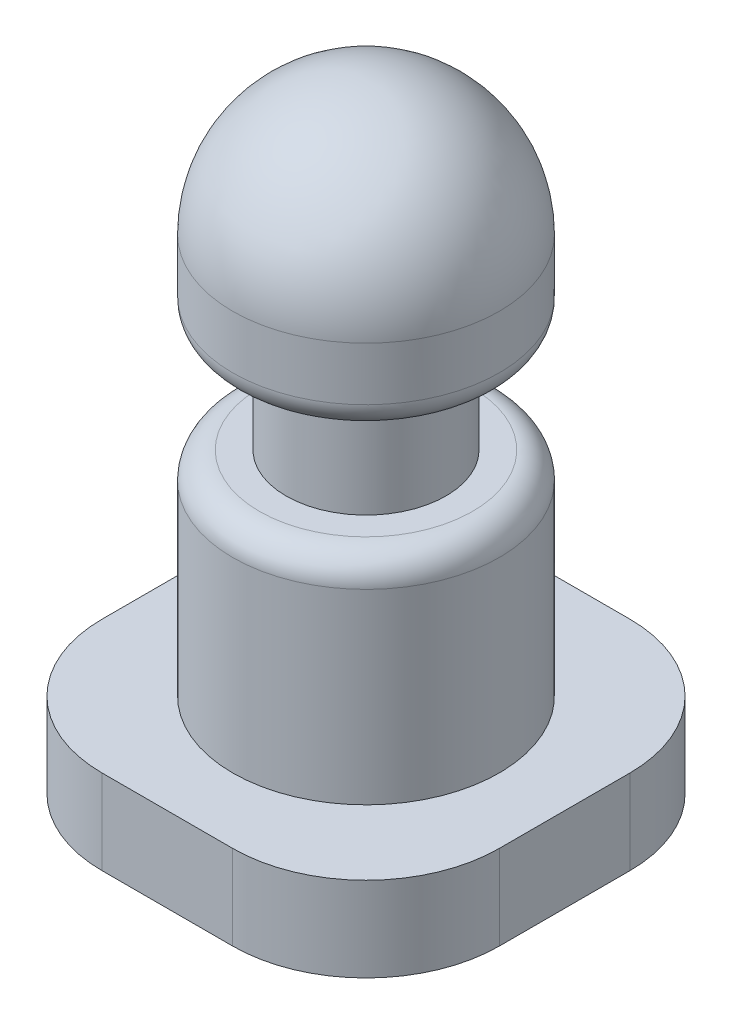
ISO-10303-21;
HEADER;
FILE_DESCRIPTION(('STEP AP214'),'2;1');
FILE_NAME('part.step','',(''),(''),'','','');
FILE_SCHEMA(('AUTOMOTIVE_DESIGN { 1 0 10303 214 1 1 1 1 }'));
ENDSEC;
DATA;
#1=APPLICATION_CONTEXT('core data for automotive mechanical design processes');
#2=APPLICATION_PROTOCOL_DEFINITION('international standard','automotive_design',2000,#1);
#3=PRODUCT_CONTEXT('',#1,'mechanical');
#4=PRODUCT('Part','Part','',(#3));
#5=PRODUCT_RELATED_PRODUCT_CATEGORY('part','',(#4));
#6=PRODUCT_DEFINITION_FORMATION('','',#4);
#7=PRODUCT_DEFINITION_CONTEXT('part definition',#1,'design');
#8=PRODUCT_DEFINITION('design','',#6,#7);
#9=PRODUCT_DEFINITION_SHAPE('','',#8);
#10=(LENGTH_UNIT() NAMED_UNIT(*) SI_UNIT(.MILLI.,.METRE.));
#11=(NAMED_UNIT(*) PLANE_ANGLE_UNIT() SI_UNIT($,.RADIAN.));
#12=(NAMED_UNIT(*) SI_UNIT($,.STERADIAN.) SOLID_ANGLE_UNIT());
#13=UNCERTAINTY_MEASURE_WITH_UNIT(LENGTH_MEASURE(1.E-05),#10,'distance_accuracy_value','');
#14=(GEOMETRIC_REPRESENTATION_CONTEXT(3) GLOBAL_UNCERTAINTY_ASSIGNED_CONTEXT((#13)) GLOBAL_UNIT_ASSIGNED_CONTEXT((#10,
#11,#12)) REPRESENTATION_CONTEXT('',''));
#15=CARTESIAN_POINT('',(0.,0.,0.));
#16=DIRECTION('',(0.,0.,1.));
#17=DIRECTION('',(1.,0.,0.));
#18=AXIS2_PLACEMENT_3D('',#15,#16,#17);
#19=CARTESIAN_POINT('',(0.,46.35,0.));
#20=DIRECTION('',(0.,-1.,0.));
#21=DIRECTION('',(0.,0.,-1.));
#22=AXIS2_PLACEMENT_3D('',#19,#20,#21);
#23=CYLINDRICAL_SURFACE('',#22,10.);
#24=CARTESIAN_POINT('',(0.,20.35,0.));
#25=DIRECTION('',(0.,1.,0.));
#26=DIRECTION('',(0.,0.,1.));
#27=AXIS2_PLACEMENT_3D('',#24,#25,#26);
#28=CIRCLE('',#27,10.);
#29=CARTESIAN_POINT('',(0.,20.35,10.));
#30=VERTEX_POINT('',#29);
#31=EDGE_CURVE('E11',#30,#30,#28,.F.);
#32=ORIENTED_EDGE('',*,*,#31,.T.);
#33=EDGE_LOOP('',(#32));
#34=FACE_BOUND('',#33,.T.);
#35=CARTESIAN_POINT('',(0.,6.35,0.));
#36=DIRECTION('',(0.,1.,0.));
#37=DIRECTION('',(0.,0.,1.));
#38=AXIS2_PLACEMENT_3D('',#35,#36,#37);
#39=CIRCLE('',#38,10.);
#40=CARTESIAN_POINT('',(0.,6.35,10.));
#41=VERTEX_POINT('',#40);
#42=EDGE_CURVE('E169',#41,#41,#39,.T.);
#43=ORIENTED_EDGE('',*,*,#42,.T.);
#44=EDGE_LOOP('',(#43));
#45=FACE_BOUND('',#44,.T.);
#46=ADVANCED_FACE('F43',(#34,#45),#23,.T.);
#47=CARTESIAN_POINT('',(-14.9,6.35,0.));
#48=DIRECTION('',(-1.,0.,0.));
#49=DIRECTION('',(0.,0.,1.));
#50=AXIS2_PLACEMENT_3D('',#47,#48,#49);
#51=PLANE('',#50);
#52=DIRECTION('',(0.,0.,-1.));
#53=VECTOR('',#52,1.);
#54=CARTESIAN_POINT('',(-14.9,0.,0.));
#55=LINE('',#54,#53);
#56=CARTESIAN_POINT('',(-14.9,0.,4.9));
#57=VERTEX_POINT('',#56);
#58=CARTESIAN_POINT('',(-14.9,0.,-4.9));
#59=VERTEX_POINT('',#58);
#60=EDGE_CURVE('E140',#57,#59,#55,.T.);
#61=ORIENTED_EDGE('',*,*,#60,.F.);
#62=DIRECTION('',(0.,-1.,0.));
#63=VECTOR('',#62,1.);
#64=CARTESIAN_POINT('',(-14.9,6.35,4.9));
#65=LINE('',#64,#63);
#66=CARTESIAN_POINT('',(-14.9,6.35,4.9));
#67=VERTEX_POINT('',#66);
#68=EDGE_CURVE('E163',#57,#67,#65,.F.);
#69=ORIENTED_EDGE('',*,*,#68,.T.);
#70=DIRECTION('',(0.,0.,-1.));
#71=VECTOR('',#70,1.);
#72=CARTESIAN_POINT('',(-14.9,6.35,0.));
#73=LINE('',#72,#71);
#74=CARTESIAN_POINT('',(-14.9,6.35,-4.9));
#75=VERTEX_POINT('',#74);
#76=EDGE_CURVE('E138',#67,#75,#73,.T.);
#77=ORIENTED_EDGE('',*,*,#76,.T.);
#78=DIRECTION('',(0.,-1.,0.));
#79=VECTOR('',#78,1.);
#80=CARTESIAN_POINT('',(-14.9,6.35,-4.9));
#81=LINE('',#80,#79);
#82=EDGE_CURVE('E160',#75,#59,#81,.T.);
#83=ORIENTED_EDGE('',*,*,#82,.T.);
#84=EDGE_LOOP('',(#61,#69,#77,#83));
#85=FACE_BOUND('',#84,.T.);
#86=ADVANCED_FACE('F200',(#85),#51,.T.);
#87=CARTESIAN_POINT('',(0.,6.35,14.9));
#88=DIRECTION('',(0.,0.,-1.));
#89=DIRECTION('',(-1.,0.,0.));
#90=AXIS2_PLACEMENT_3D('',#87,#88,#89);
#91=PLANE('',#90);
#92=DIRECTION('',(1.,0.,0.));
#93=VECTOR('',#92,1.);
#94=CARTESIAN_POINT('',(0.,0.,14.9));
#95=LINE('',#94,#93);
#96=CARTESIAN_POINT('',(-4.9,0.,14.9));
#97=VERTEX_POINT('',#96);
#98=CARTESIAN_POINT('',(4.9,0.,14.9));
#99=VERTEX_POINT('',#98);
#100=EDGE_CURVE('E136',#97,#99,#95,.T.);
#101=ORIENTED_EDGE('',*,*,#100,.T.);
#102=DIRECTION('',(0.,-1.,0.));
#103=VECTOR('',#102,1.);
#104=CARTESIAN_POINT('',(4.9,6.35,14.9));
#105=LINE('',#104,#103);
#106=CARTESIAN_POINT('',(4.9,6.35,14.9));
#107=VERTEX_POINT('',#106);
#108=EDGE_CURVE('E115',#99,#107,#105,.F.);
#109=ORIENTED_EDGE('',*,*,#108,.T.);
#110=DIRECTION('',(1.,0.,0.));
#111=VECTOR('',#110,1.);
#112=CARTESIAN_POINT('',(0.,6.35,14.9));
#113=LINE('',#112,#111);
#114=CARTESIAN_POINT('',(-4.9,6.35,14.9));
#115=VERTEX_POINT('',#114);
#116=EDGE_CURVE('E265',#115,#107,#113,.T.);
#117=ORIENTED_EDGE('',*,*,#116,.F.);
#118=DIRECTION('',(0.,-1.,0.));
#119=VECTOR('',#118,1.);
#120=CARTESIAN_POINT('',(-4.9,0.,14.9));
#121=LINE('',#120,#119);
#122=EDGE_CURVE('E120',#115,#97,#121,.T.);
#123=ORIENTED_EDGE('',*,*,#122,.T.);
#124=EDGE_LOOP('',(#101,#109,#117,#123));
#125=FACE_BOUND('',#124,.T.);
#126=ADVANCED_FACE('F208',(#125),#91,.F.);
#127=CARTESIAN_POINT('',(14.9,6.35,0.));
#128=DIRECTION('',(-1.,0.,0.));
#129=DIRECTION('',(0.,0.,1.));
#130=AXIS2_PLACEMENT_3D('',#127,#128,#129);
#131=PLANE('',#130);
#132=DIRECTION('',(0.,0.,-1.));
#133=VECTOR('',#132,1.);
#134=CARTESIAN_POINT('',(14.9,6.35,0.));
#135=LINE('',#134,#133);
#136=CARTESIAN_POINT('',(14.9,6.35,4.9));
#137=VERTEX_POINT('',#136);
#138=CARTESIAN_POINT('',(14.9,6.35,-4.9));
#139=VERTEX_POINT('',#138);
#140=EDGE_CURVE('E129',#137,#139,#135,.T.);
#141=ORIENTED_EDGE('',*,*,#140,.F.);
#142=DIRECTION('',(0.,-1.,0.));
#143=VECTOR('',#142,1.);
#144=CARTESIAN_POINT('',(14.9,6.35,4.9));
#145=LINE('',#144,#143);
#146=CARTESIAN_POINT('',(14.9,0.,4.9));
#147=VERTEX_POINT('',#146);
#148=EDGE_CURVE('E114',#137,#147,#145,.T.);
#149=ORIENTED_EDGE('',*,*,#148,.T.);
#150=DIRECTION('',(0.,0.,-1.));
#151=VECTOR('',#150,1.);
#152=CARTESIAN_POINT('',(14.9,0.,0.));
#153=LINE('',#152,#151);
#154=CARTESIAN_POINT('',(14.9,0.,-4.9));
#155=VERTEX_POINT('',#154);
#156=EDGE_CURVE('E127',#147,#155,#153,.T.);
#157=ORIENTED_EDGE('',*,*,#156,.T.);
#158=DIRECTION('',(0.,-1.,0.));
#159=VECTOR('',#158,1.);
#160=CARTESIAN_POINT('',(14.9,6.35,-4.9));
#161=LINE('',#160,#159);
#162=EDGE_CURVE('E131',#155,#139,#161,.F.);
#163=ORIENTED_EDGE('',*,*,#162,.T.);
#164=EDGE_LOOP('',(#141,#149,#157,#163));
#165=FACE_BOUND('',#164,.T.);
#166=ADVANCED_FACE('F126',(#165),#131,.F.);
#167=CARTESIAN_POINT('',(0.,6.35,-14.9));
#168=DIRECTION('',(0.,0.,-1.));
#169=DIRECTION('',(-1.,0.,0.));
#170=AXIS2_PLACEMENT_3D('',#167,#168,#169);
#171=PLANE('',#170);
#172=DIRECTION('',(1.,0.,0.));
#173=VECTOR('',#172,1.);
#174=CARTESIAN_POINT('',(0.,0.,-14.9));
#175=LINE('',#174,#173);
#176=CARTESIAN_POINT('',(-4.9,0.,-14.9));
#177=VERTEX_POINT('',#176);
#178=CARTESIAN_POINT('',(4.9,0.,-14.9));
#179=VERTEX_POINT('',#178);
#180=EDGE_CURVE('E135',#177,#179,#175,.T.);
#181=ORIENTED_EDGE('',*,*,#180,.F.);
#182=DIRECTION('',(0.,-1.,0.));
#183=VECTOR('',#182,1.);
#184=CARTESIAN_POINT('',(-4.9,6.35,-14.9));
#185=LINE('',#184,#183);
#186=CARTESIAN_POINT('',(-4.9,6.35,-14.9));
#187=VERTEX_POINT('',#186);
#188=EDGE_CURVE('E65',#177,#187,#185,.F.);
#189=ORIENTED_EDGE('',*,*,#188,.T.);
#190=DIRECTION('',(1.,0.,0.));
#191=VECTOR('',#190,1.);
#192=CARTESIAN_POINT('',(0.,6.35,-14.9));
#193=LINE('',#192,#191);
#194=CARTESIAN_POINT('',(4.9,6.35,-14.9));
#195=VERTEX_POINT('',#194);
#196=EDGE_CURVE('E144',#187,#195,#193,.T.);
#197=ORIENTED_EDGE('',*,*,#196,.T.);
#198=DIRECTION('',(0.,-1.,0.));
#199=VECTOR('',#198,1.);
#200=CARTESIAN_POINT('',(4.9,0.,-14.9));
#201=LINE('',#200,#199);
#202=EDGE_CURVE('E165',#195,#179,#201,.T.);
#203=ORIENTED_EDGE('',*,*,#202,.T.);
#204=EDGE_LOOP('',(#181,#189,#197,#203));
#205=FACE_BOUND('',#204,.T.);
#206=ADVANCED_FACE('F253',(#205),#171,.T.);
#207=CARTESIAN_POINT('',(0.,6.35,0.));
#208=DIRECTION('',(0.,1.,0.));
#209=DIRECTION('',(0.,0.,1.));
#210=AXIS2_PLACEMENT_3D('',#207,#208,#209);
#211=PLANE('',#210);
#212=ORIENTED_EDGE('',*,*,#42,.F.);
#213=EDGE_LOOP('',(#212));
#214=FACE_BOUND('',#213,.T.);
#215=ORIENTED_EDGE('',*,*,#116,.T.);
#216=CARTESIAN_POINT('',(4.9,6.35,4.9));
#217=DIRECTION('',(0.,1.,0.));
#218=DIRECTION('',(0.,0.,1.));
#219=AXIS2_PLACEMENT_3D('',#216,#217,#218);
#220=CIRCLE('',#219,10.);
#221=EDGE_CURVE('E158',#107,#137,#220,.T.);
#222=ORIENTED_EDGE('',*,*,#221,.T.);
#223=ORIENTED_EDGE('',*,*,#140,.T.);
#224=CARTESIAN_POINT('',(4.9,6.35,-4.9));
#225=DIRECTION('',(0.,1.,0.));
#226=DIRECTION('',(0.,0.,1.));
#227=AXIS2_PLACEMENT_3D('',#224,#225,#226);
#228=CIRCLE('',#227,10.);
#229=EDGE_CURVE('E58',#139,#195,#228,.T.);
#230=ORIENTED_EDGE('',*,*,#229,.T.);
#231=ORIENTED_EDGE('',*,*,#196,.F.);
#232=CARTESIAN_POINT('',(-4.9,6.35,-4.9));
#233=DIRECTION('',(0.,1.,0.));
#234=DIRECTION('',(0.,0.,1.));
#235=AXIS2_PLACEMENT_3D('',#232,#233,#234);
#236=CIRCLE('',#235,10.);
#237=EDGE_CURVE('E154',#187,#75,#236,.T.);
#238=ORIENTED_EDGE('',*,*,#237,.T.);
#239=ORIENTED_EDGE('',*,*,#76,.F.);
#240=CARTESIAN_POINT('',(-4.9,6.35,4.9));
#241=DIRECTION('',(0.,1.,0.));
#242=DIRECTION('',(0.,0.,1.));
#243=AXIS2_PLACEMENT_3D('',#240,#241,#242);
#244=CIRCLE('',#243,10.);
#245=EDGE_CURVE('E156',#67,#115,#244,.T.);
#246=ORIENTED_EDGE('',*,*,#245,.T.);
#247=EDGE_LOOP('',(#215,#222,#223,#230,#231,#238,#239,#246));
#248=FACE_BOUND('',#247,.T.);
#249=ADVANCED_FACE('F256',(#214,#248),#211,.T.);
#250=CARTESIAN_POINT('',(0.,0.,0.));
#251=DIRECTION('',(0.,1.,0.));
#252=DIRECTION('',(0.,0.,1.));
#253=AXIS2_PLACEMENT_3D('',#250,#251,#252);
#254=PLANE('',#253);
#255=CARTESIAN_POINT('',(0.,0.,0.));
#256=DIRECTION('',(0.,-1.,0.));
#257=DIRECTION('',(0.,0.,-1.));
#258=AXIS2_PLACEMENT_3D('',#255,#256,#257);
#259=CIRCLE('',#258,2.1225);
#260=CARTESIAN_POINT('',(0.,0.,-2.1225));
#261=VERTEX_POINT('',#260);
#262=EDGE_CURVE('E287',#261,#261,#259,.T.);
#263=ORIENTED_EDGE('',*,*,#262,.F.);
#264=EDGE_LOOP('',(#263));
#265=FACE_BOUND('',#264,.T.);
#266=ORIENTED_EDGE('',*,*,#156,.F.);
#267=CARTESIAN_POINT('',(4.9,0.,4.9));
#268=DIRECTION('',(0.,1.,0.));
#269=DIRECTION('',(0.,0.,1.));
#270=AXIS2_PLACEMENT_3D('',#267,#268,#269);
#271=CIRCLE('',#270,10.);
#272=EDGE_CURVE('E110',#147,#99,#271,.F.);
#273=ORIENTED_EDGE('',*,*,#272,.T.);
#274=ORIENTED_EDGE('',*,*,#100,.F.);
#275=CARTESIAN_POINT('',(-4.9,0.,4.9));
#276=DIRECTION('',(0.,1.,0.));
#277=DIRECTION('',(0.,0.,1.));
#278=AXIS2_PLACEMENT_3D('',#275,#276,#277);
#279=CIRCLE('',#278,10.);
#280=EDGE_CURVE('E121',#97,#57,#279,.F.);
#281=ORIENTED_EDGE('',*,*,#280,.T.);
#282=ORIENTED_EDGE('',*,*,#60,.T.);
#283=CARTESIAN_POINT('',(-4.9,0.,-4.9));
#284=DIRECTION('',(0.,1.,0.));
#285=DIRECTION('',(0.,0.,1.));
#286=AXIS2_PLACEMENT_3D('',#283,#284,#285);
#287=CIRCLE('',#286,10.);
#288=EDGE_CURVE('E147',#59,#177,#287,.F.);
#289=ORIENTED_EDGE('',*,*,#288,.T.);
#290=ORIENTED_EDGE('',*,*,#180,.T.);
#291=CARTESIAN_POINT('',(4.9,0.,-4.9));
#292=DIRECTION('',(0.,1.,0.));
#293=DIRECTION('',(0.,0.,1.));
#294=AXIS2_PLACEMENT_3D('',#291,#292,#293);
#295=CIRCLE('',#294,10.);
#296=EDGE_CURVE('E130',#179,#155,#295,.F.);
#297=ORIENTED_EDGE('',*,*,#296,.T.);
#298=EDGE_LOOP('',(#266,#273,#274,#281,#282,#289,#290,#297));
#299=FACE_BOUND('',#298,.T.);
#300=ADVANCED_FACE('F133',(#265,#299),#254,.F.);
#301=CARTESIAN_POINT('',(4.9,6.35,4.9));
#302=DIRECTION('',(0.,-1.,0.));
#303=DIRECTION('',(0.,0.,-1.));
#304=AXIS2_PLACEMENT_3D('',#301,#302,#303);
#305=CYLINDRICAL_SURFACE('',#304,10.);
#306=ORIENTED_EDGE('',*,*,#221,.F.);
#307=ORIENTED_EDGE('',*,*,#108,.F.);
#308=ORIENTED_EDGE('',*,*,#272,.F.);
#309=ORIENTED_EDGE('',*,*,#148,.F.);
#310=EDGE_LOOP('',(#306,#307,#308,#309));
#311=FACE_BOUND('',#310,.T.);
#312=ADVANCED_FACE('F113',(#311),#305,.T.);
#313=CARTESIAN_POINT('',(-4.9,6.35,4.9));
#314=DIRECTION('',(0.,1.,0.));
#315=DIRECTION('',(0.,0.,1.));
#316=AXIS2_PLACEMENT_3D('',#313,#314,#315);
#317=CYLINDRICAL_SURFACE('',#316,10.);
#318=ORIENTED_EDGE('',*,*,#245,.F.);
#319=ORIENTED_EDGE('',*,*,#68,.F.);
#320=ORIENTED_EDGE('',*,*,#280,.F.);
#321=ORIENTED_EDGE('',*,*,#122,.F.);
#322=EDGE_LOOP('',(#318,#319,#320,#321));
#323=FACE_BOUND('',#322,.T.);
#324=ADVANCED_FACE('F241',(#323),#317,.T.);
#325=CARTESIAN_POINT('',(-4.9,6.35,-4.9));
#326=DIRECTION('',(0.,-1.,0.));
#327=DIRECTION('',(0.,0.,-1.));
#328=AXIS2_PLACEMENT_3D('',#325,#326,#327);
#329=CYLINDRICAL_SURFACE('',#328,10.);
#330=ORIENTED_EDGE('',*,*,#237,.F.);
#331=ORIENTED_EDGE('',*,*,#188,.F.);
#332=ORIENTED_EDGE('',*,*,#288,.F.);
#333=ORIENTED_EDGE('',*,*,#82,.F.);
#334=EDGE_LOOP('',(#330,#331,#332,#333));
#335=FACE_BOUND('',#334,.T.);
#336=ADVANCED_FACE('F237',(#335),#329,.T.);
#337=CARTESIAN_POINT('',(4.9,6.35,-4.9));
#338=DIRECTION('',(0.,1.,0.));
#339=DIRECTION('',(0.,0.,1.));
#340=AXIS2_PLACEMENT_3D('',#337,#338,#339);
#341=CYLINDRICAL_SURFACE('',#340,10.);
#342=ORIENTED_EDGE('',*,*,#229,.F.);
#343=ORIENTED_EDGE('',*,*,#162,.F.);
#344=ORIENTED_EDGE('',*,*,#296,.F.);
#345=ORIENTED_EDGE('',*,*,#202,.F.);
#346=EDGE_LOOP('',(#342,#343,#344,#345));
#347=FACE_BOUND('',#346,.T.);
#348=ADVANCED_FACE('F233',(#347),#341,.T.);
#349=CARTESIAN_POINT('',(0.,30.35,0.));
#350=DIRECTION('',(0.,1.,0.));
#351=DIRECTION('',(0.,0.,1.));
#352=AXIS2_PLACEMENT_3D('',#349,#350,#351);
#353=PLANE('',#352);
#354=CARTESIAN_POINT('',(0.,30.35,0.));
#355=DIRECTION('',(0.,1.,0.));
#356=DIRECTION('',(0.,0.,1.));
#357=AXIS2_PLACEMENT_3D('',#354,#355,#356);
#358=CIRCLE('',#357,8.);
#359=CARTESIAN_POINT('',(0.,30.35,8.));
#360=VERTEX_POINT('',#359);
#361=EDGE_CURVE('E176',#360,#360,#358,.F.);
#362=ORIENTED_EDGE('',*,*,#361,.T.);
#363=EDGE_LOOP('',(#362));
#364=FACE_BOUND('',#363,.T.);
#365=CARTESIAN_POINT('',(0.,30.35,0.));
#366=DIRECTION('',(0.,1.,0.));
#367=DIRECTION('',(0.,0.,1.));
#368=AXIS2_PLACEMENT_3D('',#365,#366,#367);
#369=CIRCLE('',#368,6.);
#370=CARTESIAN_POINT('',(0.,30.35,6.));
#371=VERTEX_POINT('',#370);
#372=EDGE_CURVE('E276',#371,#371,#369,.T.);
#373=ORIENTED_EDGE('',*,*,#372,.T.);
#374=EDGE_LOOP('',(#373));
#375=FACE_BOUND('',#374,.T.);
#376=ADVANCED_FACE('F236',(#364,#375),#353,.F.);
#377=CARTESIAN_POINT('',(0.,30.35,0.));
#378=DIRECTION('',(0.,-1.,0.));
#379=DIRECTION('',(0.,0.,-1.));
#380=AXIS2_PLACEMENT_3D('',#377,#378,#379);
#381=CYLINDRICAL_SURFACE('',#380,6.);
#382=ORIENTED_EDGE('',*,*,#372,.F.);
#383=EDGE_LOOP('',(#382));
#384=FACE_BOUND('',#383,.T.);
#385=CARTESIAN_POINT('',(0.,22.35,0.));
#386=DIRECTION('',(0.,1.,0.));
#387=DIRECTION('',(0.,0.,1.));
#388=AXIS2_PLACEMENT_3D('',#385,#386,#387);
#389=CIRCLE('',#388,6.);
#390=CARTESIAN_POINT('',(0.,22.35,6.));
#391=VERTEX_POINT('',#390);
#392=EDGE_CURVE('E279',#391,#391,#389,.T.);
#393=ORIENTED_EDGE('',*,*,#392,.T.);
#394=EDGE_LOOP('',(#393));
#395=FACE_BOUND('',#394,.T.);
#396=ADVANCED_FACE('F230',(#384,#395),#381,.T.);
#397=CARTESIAN_POINT('',(0.,22.35,0.));
#398=DIRECTION('',(0.,1.,0.));
#399=DIRECTION('',(0.,0.,1.));
#400=AXIS2_PLACEMENT_3D('',#397,#398,#399);
#401=PLANE('',#400);
#402=CARTESIAN_POINT('',(0.,22.35,0.));
#403=DIRECTION('',(0.,1.,0.));
#404=DIRECTION('',(0.,0.,1.));
#405=AXIS2_PLACEMENT_3D('',#402,#403,#404);
#406=CIRCLE('',#405,8.);
#407=CARTESIAN_POINT('',(0.,22.35,8.));
#408=VERTEX_POINT('',#407);
#409=EDGE_CURVE('E51',#408,#408,#406,.T.);
#410=ORIENTED_EDGE('',*,*,#409,.T.);
#411=EDGE_LOOP('',(#410));
#412=FACE_BOUND('',#411,.T.);
#413=ORIENTED_EDGE('',*,*,#392,.F.);
#414=EDGE_LOOP('',(#413));
#415=FACE_BOUND('',#414,.T.);
#416=ADVANCED_FACE('F181',(#412,#415),#401,.T.);
#417=CARTESIAN_POINT('',(0.,36.35,0.));
#418=DIRECTION('',(0.,1.,0.));
#419=DIRECTION('',(0.,0.,1.));
#420=AXIS2_PLACEMENT_3D('',#417,#418,#419);
#421=SPHERICAL_SURFACE('',#420,10.);
#422=CARTESIAN_POINT('',(0.,36.35,0.));
#423=DIRECTION('',(0.,-1.,0.));
#424=DIRECTION('',(0.,0.,-1.));
#425=AXIS2_PLACEMENT_3D('',#422,#423,#424);
#426=CIRCLE('',#425,10.);
#427=CARTESIAN_POINT('',(0.,36.35,-10.));
#428=VERTEX_POINT('',#427);
#429=EDGE_CURVE('E170',#428,#428,#426,.T.);
#430=ORIENTED_EDGE('',*,*,#429,.F.);
#431=EDGE_LOOP('',(#430));
#432=FACE_BOUND('',#431,.T.);
#433=ADVANCED_FACE('F215',(#432),#421,.T.);
#434=CARTESIAN_POINT('',(0.,32.35,0.));
#435=DIRECTION('',(0.,1.,0.));
#436=DIRECTION('',(0.,0.,1.));
#437=AXIS2_PLACEMENT_3D('',#434,#435,#436);
#438=CIRCLE('',#437,10.);
#439=CARTESIAN_POINT('',(0.,32.35,10.));
#440=VERTEX_POINT('',#439);
#441=EDGE_CURVE('E173',#440,#440,#438,.T.);
#442=ORIENTED_EDGE('',*,*,#441,.T.);
#443=EDGE_LOOP('',(#442));
#444=FACE_BOUND('',#443,.T.);
#445=ORIENTED_EDGE('',*,*,#429,.T.);
#446=EDGE_LOOP('',(#445));
#447=FACE_BOUND('',#446,.T.);
#448=ADVANCED_FACE('F196',(#444,#447),#23,.T.);
#449=CARTESIAN_POINT('',(0.,32.35,0.));
#450=DIRECTION('',(0.,1.,0.));
#451=DIRECTION('',(0.,0.,1.));
#452=AXIS2_PLACEMENT_3D('',#449,#450,#451);
#453=TOROIDAL_SURFACE('',#452,8.,2.);
#454=ORIENTED_EDGE('',*,*,#361,.F.);
#455=EDGE_LOOP('',(#454));
#456=FACE_BOUND('',#455,.T.);
#457=ORIENTED_EDGE('',*,*,#441,.F.);
#458=EDGE_LOOP('',(#457));
#459=FACE_BOUND('',#458,.T.);
#460=ADVANCED_FACE('F186',(#456,#459),#453,.T.);
#461=CARTESIAN_POINT('',(0.,20.35,0.));
#462=DIRECTION('',(0.,1.,0.));
#463=DIRECTION('',(0.,0.,1.));
#464=AXIS2_PLACEMENT_3D('',#461,#462,#463);
#465=TOROIDAL_SURFACE('',#464,8.,2.);
#466=ORIENTED_EDGE('',*,*,#31,.F.);
#467=EDGE_LOOP('',(#466));
#468=FACE_BOUND('',#467,.T.);
#469=ORIENTED_EDGE('',*,*,#409,.F.);
#470=EDGE_LOOP('',(#469));
#471=FACE_BOUND('',#470,.T.);
#472=ADVANCED_FACE('F45',(#468,#471),#465,.T.);
#473=CARTESIAN_POINT('',(0.,5.,0.));
#474=DIRECTION('',(0.,-1.,0.));
#475=DIRECTION('',(0.,0.,-1.));
#476=AXIS2_PLACEMENT_3D('',#473,#474,#475);
#477=CYLINDRICAL_SURFACE('',#476,2.1225);
#478=CARTESIAN_POINT('',(0.,5.,0.));
#479=DIRECTION('',(0.,-1.,0.));
#480=DIRECTION('',(0.,0.,-1.));
#481=AXIS2_PLACEMENT_3D('',#478,#479,#480);
#482=CIRCLE('',#481,2.1225);
#483=CARTESIAN_POINT('',(0.,5.,-2.1225));
#484=VERTEX_POINT('',#483);
#485=EDGE_CURVE('E284',#484,#484,#482,.T.);
#486=ORIENTED_EDGE('',*,*,#485,.F.);
#487=EDGE_LOOP('',(#486));
#488=FACE_BOUND('',#487,.T.);
#489=ORIENTED_EDGE('',*,*,#262,.T.);
#490=EDGE_LOOP('',(#489));
#491=FACE_BOUND('',#490,.T.);
#492=ADVANCED_FACE('F185',(#488,#491),#477,.F.);
#493=CARTESIAN_POINT('',(0.,5.,0.));
#494=DIRECTION('',(0.,-1.,0.));
#495=DIRECTION('',(0.,0.,-1.));
#496=AXIS2_PLACEMENT_3D('',#493,#494,#495);
#497=PLANE('',#496);
#498=ORIENTED_EDGE('',*,*,#485,.T.);
#499=EDGE_LOOP('',(#498));
#500=FACE_BOUND('',#499,.T.);
#501=ADVANCED_FACE('F193',(#500),#497,.T.);
#502=CLOSED_SHELL('',(#46,#86,#126,#166,#206,#249,#300,#312,#324,#336,#348,#376,#396,#416,#433,
#448,#460,#472,#492,#501));
#503=MANIFOLD_SOLID_BREP('B2',#502);
#504=ADVANCED_BREP_SHAPE_REPRESENTATION('',(#18,#503),#14);
#505=SHAPE_DEFINITION_REPRESENTATION(#9,#504);
ENDSEC;
END-ISO-10303-21;
